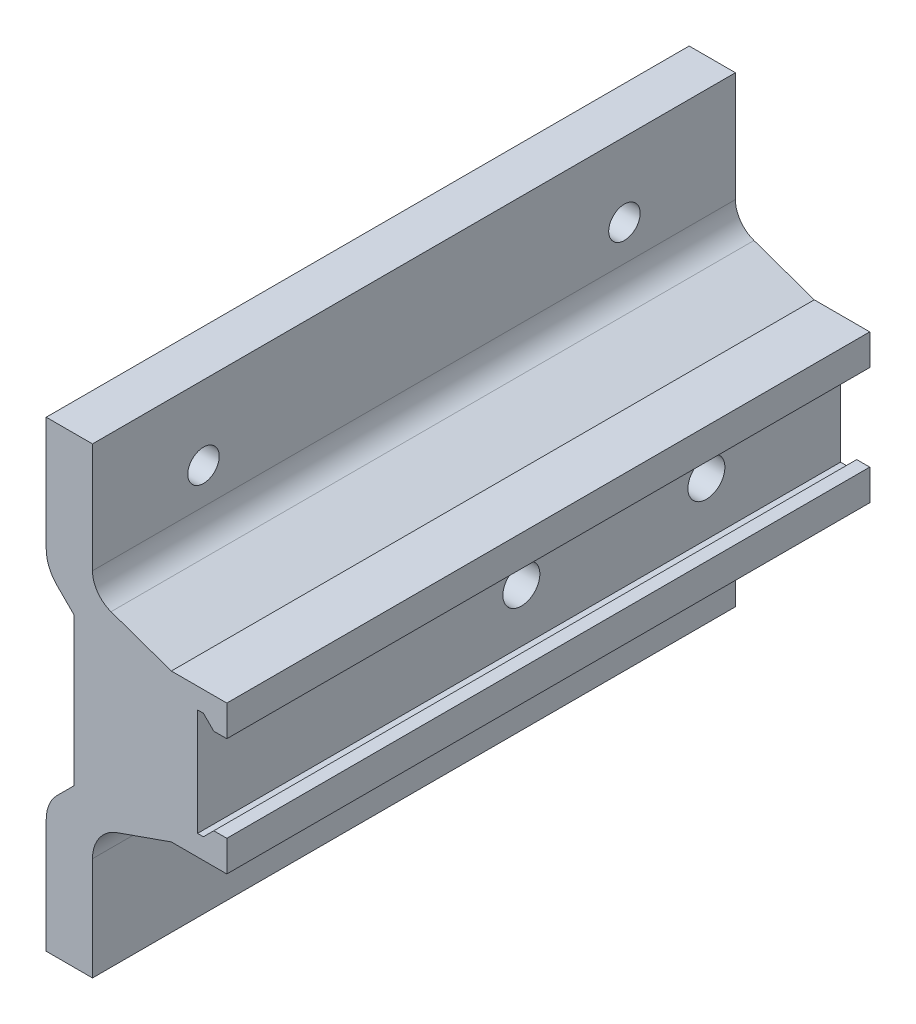
ISO-10303-21;
HEADER;
FILE_DESCRIPTION(('STEP AP214'),'2;1');
FILE_NAME('part.step','',(''),(''),'','','');
FILE_SCHEMA(('AUTOMOTIVE_DESIGN { 1 0 10303 214 1 1 1 1 }'));
ENDSEC;
DATA;
#1=APPLICATION_CONTEXT('core data for automotive mechanical design processes');
#2=APPLICATION_PROTOCOL_DEFINITION('international standard','automotive_design',2000,#1);
#3=PRODUCT_CONTEXT('',#1,'mechanical');
#4=PRODUCT('Part','Part','',(#3));
#5=PRODUCT_RELATED_PRODUCT_CATEGORY('part','',(#4));
#6=PRODUCT_DEFINITION_FORMATION('','',#4);
#7=PRODUCT_DEFINITION_CONTEXT('part definition',#1,'design');
#8=PRODUCT_DEFINITION('design','',#6,#7);
#9=PRODUCT_DEFINITION_SHAPE('','',#8);
#10=(LENGTH_UNIT() NAMED_UNIT(*) SI_UNIT(.MILLI.,.METRE.));
#11=(NAMED_UNIT(*) PLANE_ANGLE_UNIT() SI_UNIT($,.RADIAN.));
#12=(NAMED_UNIT(*) SI_UNIT($,.STERADIAN.) SOLID_ANGLE_UNIT());
#13=UNCERTAINTY_MEASURE_WITH_UNIT(LENGTH_MEASURE(1.E-05),#10,'distance_accuracy_value','');
#14=(GEOMETRIC_REPRESENTATION_CONTEXT(3) GLOBAL_UNCERTAINTY_ASSIGNED_CONTEXT((#13)) GLOBAL_UNIT_ASSIGNED_CONTEXT((#10,
#11,#12)) REPRESENTATION_CONTEXT('',''));
#15=CARTESIAN_POINT('',(0.,0.,0.));
#16=DIRECTION('',(0.,0.,1.));
#17=DIRECTION('',(1.,0.,0.));
#18=AXIS2_PLACEMENT_3D('',#15,#16,#17);
#19=CARTESIAN_POINT('',(-4.30260211183039,-5.62653158943432,69.5));
#20=DIRECTION('',(0.,1.,0.));
#21=DIRECTION('',(-1.,0.,0.));
#22=AXIS2_PLACEMENT_3D('',#19,#20,#21);
#23=PLANE('',#22);
#24=DIRECTION('',(1.,0.,0.));
#25=VECTOR('',#24,1.);
#26=CARTESIAN_POINT('',(-4.30260211183039,-5.62653158943432,0.));
#27=LINE('',#26,#25);
#28=CARTESIAN_POINT('',(-10.3026021118304,-5.62653158943431,0.));
#29=VERTEX_POINT('',#28);
#30=CARTESIAN_POINT('',(-4.30260211183039,-5.62653158943432,0.));
#31=VERTEX_POINT('',#30);
#32=EDGE_CURVE('E153',#29,#31,#27,.T.);
#33=ORIENTED_EDGE('',*,*,#32,.T.);
#34=DIRECTION('',(0.,0.,-1.));
#35=VECTOR('',#34,1.);
#36=CARTESIAN_POINT('',(-4.30260211183039,-5.62653158943432,69.5));
#37=LINE('',#36,#35);
#38=CARTESIAN_POINT('',(-4.30260211183039,-5.62653158943432,69.5));
#39=VERTEX_POINT('',#38);
#40=EDGE_CURVE('E42',#39,#31,#37,.T.);
#41=ORIENTED_EDGE('',*,*,#40,.F.);
#42=DIRECTION('',(1.,0.,0.));
#43=VECTOR('',#42,1.);
#44=CARTESIAN_POINT('',(-4.30260211183039,-5.62653158943432,69.5));
#45=LINE('',#44,#43);
#46=CARTESIAN_POINT('',(-10.3026021118304,-5.62653158943431,69.5));
#47=VERTEX_POINT('',#46);
#48=EDGE_CURVE('E105',#47,#39,#45,.T.);
#49=ORIENTED_EDGE('',*,*,#48,.F.);
#50=DIRECTION('',(0.,0.,-1.));
#51=VECTOR('',#50,1.);
#52=CARTESIAN_POINT('',(-10.3026021118304,-5.62653158943431,69.5));
#53=LINE('',#52,#51);
#54=EDGE_CURVE('E11',#47,#29,#53,.T.);
#55=ORIENTED_EDGE('',*,*,#54,.T.);
#56=EDGE_LOOP('',(#33,#41,#49,#55));
#57=FACE_BOUND('',#56,.T.);
#58=ADVANCED_FACE('F33',(#57),#23,.F.);
#59=CARTESIAN_POINT('',(-4.30260211183039,-2.28653158943431,69.5));
#60=DIRECTION('',(-1.,0.,0.));
#61=DIRECTION('',(0.,0.,1.));
#62=AXIS2_PLACEMENT_3D('',#59,#60,#61);
#63=PLANE('',#62);
#64=DIRECTION('',(0.,1.,0.));
#65=VECTOR('',#64,1.);
#66=CARTESIAN_POINT('',(-4.30260211183039,-2.28653158943431,0.));
#67=LINE('',#66,#65);
#68=CARTESIAN_POINT('',(-4.30260211183039,-2.28653158943431,0.));
#69=VERTEX_POINT('',#68);
#70=EDGE_CURVE('E155',#31,#69,#67,.T.);
#71=ORIENTED_EDGE('',*,*,#70,.T.);
#72=DIRECTION('',(0.,0.,-1.));
#73=VECTOR('',#72,1.);
#74=CARTESIAN_POINT('',(-4.30260211183039,-2.28653158943431,69.5));
#75=LINE('',#74,#73);
#76=CARTESIAN_POINT('',(-4.30260211183039,-2.28653158943431,69.5));
#77=VERTEX_POINT('',#76);
#78=EDGE_CURVE('E194',#77,#69,#75,.T.);
#79=ORIENTED_EDGE('',*,*,#78,.F.);
#80=DIRECTION('',(0.,1.,0.));
#81=VECTOR('',#80,1.);
#82=CARTESIAN_POINT('',(-4.30260211183039,-2.28653158943431,69.5));
#83=LINE('',#82,#81);
#84=EDGE_CURVE('E365',#39,#77,#83,.T.);
#85=ORIENTED_EDGE('',*,*,#84,.F.);
#86=ORIENTED_EDGE('',*,*,#40,.T.);
#87=EDGE_LOOP('',(#71,#79,#85,#86));
#88=FACE_BOUND('',#87,.T.);
#89=ADVANCED_FACE('F488',(#88),#63,.F.);
#90=CARTESIAN_POINT('',(-5.71260211183039,-2.28653158943431,69.5));
#91=DIRECTION('',(0.,-1.,0.));
#92=DIRECTION('',(0.,0.,-1.));
#93=AXIS2_PLACEMENT_3D('',#90,#91,#92);
#94=PLANE('',#93);
#95=DIRECTION('',(-1.,0.,0.));
#96=VECTOR('',#95,1.);
#97=CARTESIAN_POINT('',(-5.71260211183039,-2.28653158943431,0.));
#98=LINE('',#97,#96);
#99=CARTESIAN_POINT('',(-5.71260211183039,-2.28653158943431,0.));
#100=VERTEX_POINT('',#99);
#101=EDGE_CURVE('E158',#69,#100,#98,.T.);
#102=ORIENTED_EDGE('',*,*,#101,.T.);
#103=DIRECTION('',(0.,0.,-1.));
#104=VECTOR('',#103,1.);
#105=CARTESIAN_POINT('',(-5.71260211183039,-2.28653158943431,69.5));
#106=LINE('',#105,#104);
#107=CARTESIAN_POINT('',(-5.71260211183039,-2.28653158943431,69.5));
#108=VERTEX_POINT('',#107);
#109=EDGE_CURVE('E191',#108,#100,#106,.T.);
#110=ORIENTED_EDGE('',*,*,#109,.F.);
#111=DIRECTION('',(-1.,0.,0.));
#112=VECTOR('',#111,1.);
#113=CARTESIAN_POINT('',(-5.71260211183039,-2.28653158943431,69.5));
#114=LINE('',#113,#112);
#115=EDGE_CURVE('E367',#77,#108,#114,.T.);
#116=ORIENTED_EDGE('',*,*,#115,.F.);
#117=ORIENTED_EDGE('',*,*,#78,.T.);
#118=EDGE_LOOP('',(#102,#110,#116,#117));
#119=FACE_BOUND('',#118,.T.);
#120=ADVANCED_FACE('F492',(#119),#94,.F.);
#121=CARTESIAN_POINT('',(-6.8326021118304,-3.40653158943431,69.5));
#122=DIRECTION('',(0.707106781186547,-0.707106781186548,0.));
#123=DIRECTION('',(0.707106781186548,0.707106781186547,0.));
#124=AXIS2_PLACEMENT_3D('',#121,#122,#123);
#125=PLANE('',#124);
#126=DIRECTION('',(-0.707106781186548,-0.707106781186547,0.));
#127=VECTOR('',#126,1.);
#128=CARTESIAN_POINT('',(-6.8326021118304,-3.40653158943431,0.));
#129=LINE('',#128,#127);
#130=CARTESIAN_POINT('',(-6.8326021118304,-3.40653158943431,0.));
#131=VERTEX_POINT('',#130);
#132=EDGE_CURVE('E160',#100,#131,#129,.T.);
#133=ORIENTED_EDGE('',*,*,#132,.T.);
#134=DIRECTION('',(0.,0.,-1.));
#135=VECTOR('',#134,1.);
#136=CARTESIAN_POINT('',(-6.8326021118304,-3.40653158943431,69.5));
#137=LINE('',#136,#135);
#138=CARTESIAN_POINT('',(-6.8326021118304,-3.40653158943431,69.5));
#139=VERTEX_POINT('',#138);
#140=EDGE_CURVE('E188',#139,#131,#137,.T.);
#141=ORIENTED_EDGE('',*,*,#140,.F.);
#142=DIRECTION('',(-0.707106781186548,-0.707106781186547,0.));
#143=VECTOR('',#142,1.);
#144=CARTESIAN_POINT('',(-6.8326021118304,-3.40653158943431,69.5));
#145=LINE('',#144,#143);
#146=EDGE_CURVE('E369',#108,#139,#145,.T.);
#147=ORIENTED_EDGE('',*,*,#146,.F.);
#148=ORIENTED_EDGE('',*,*,#109,.T.);
#149=EDGE_LOOP('',(#133,#141,#147,#148));
#150=FACE_BOUND('',#149,.T.);
#151=ADVANCED_FACE('F505',(#150),#125,.F.);
#152=CARTESIAN_POINT('',(-6.8326021118304,-3.40653158943431,69.5));
#153=DIRECTION('',(0.,-1.,0.));
#154=DIRECTION('',(0.,0.,-1.));
#155=AXIS2_PLACEMENT_3D('',#152,#153,#154);
#156=PLANE('',#155);
#157=DIRECTION('',(-1.,0.,0.));
#158=VECTOR('',#157,1.);
#159=CARTESIAN_POINT('',(-6.8326021118304,-3.40653158943431,0.));
#160=LINE('',#159,#158);
#161=CARTESIAN_POINT('',(-7.4626021118304,-3.40653158943431,0.));
#162=VERTEX_POINT('',#161);
#163=EDGE_CURVE('E162',#131,#162,#160,.T.);
#164=ORIENTED_EDGE('',*,*,#163,.T.);
#165=DIRECTION('',(0.,0.,-1.));
#166=VECTOR('',#165,1.);
#167=CARTESIAN_POINT('',(-7.4626021118304,-3.40653158943431,69.5));
#168=LINE('',#167,#166);
#169=CARTESIAN_POINT('',(-7.4626021118304,-3.40653158943431,69.5));
#170=VERTEX_POINT('',#169);
#171=EDGE_CURVE('E185',#170,#162,#168,.T.);
#172=ORIENTED_EDGE('',*,*,#171,.F.);
#173=DIRECTION('',(-1.,0.,0.));
#174=VECTOR('',#173,1.);
#175=CARTESIAN_POINT('',(-6.8326021118304,-3.40653158943431,69.5));
#176=LINE('',#175,#174);
#177=EDGE_CURVE('E371',#139,#170,#176,.T.);
#178=ORIENTED_EDGE('',*,*,#177,.F.);
#179=ORIENTED_EDGE('',*,*,#140,.T.);
#180=EDGE_LOOP('',(#164,#172,#178,#179));
#181=FACE_BOUND('',#180,.T.);
#182=ADVANCED_FACE('F583',(#181),#156,.F.);
#183=CARTESIAN_POINT('',(-7.4626021118304,8.15346841056569,69.5));
#184=DIRECTION('',(-1.,0.,0.));
#185=DIRECTION('',(0.,0.,1.));
#186=AXIS2_PLACEMENT_3D('',#183,#184,#185);
#187=PLANE('',#186);
#188=CARTESIAN_POINT('',(-7.4626021118304,2.37346841056569,34.5));
#189=DIRECTION('',(-1.,0.,0.));
#190=DIRECTION('',(0.,0.,1.));
#191=AXIS2_PLACEMENT_3D('',#188,#189,#190);
#192=CIRCLE('',#191,2.);
#193=CARTESIAN_POINT('',(-7.4626021118304,2.37346841056569,36.5));
#194=VERTEX_POINT('',#193);
#195=EDGE_CURVE('E207',#194,#194,#192,.T.);
#196=ORIENTED_EDGE('',*,*,#195,.T.);
#197=EDGE_LOOP('',(#196));
#198=FACE_BOUND('',#197,.T.);
#199=CARTESIAN_POINT('',(-7.4626021118304,2.37346841056569,14.5));
#200=DIRECTION('',(-1.,0.,0.));
#201=DIRECTION('',(0.,0.,1.));
#202=AXIS2_PLACEMENT_3D('',#199,#200,#201);
#203=CIRCLE('',#202,2.);
#204=CARTESIAN_POINT('',(-7.4626021118304,2.37346841056569,16.5));
#205=VERTEX_POINT('',#204);
#206=EDGE_CURVE('E202',#205,#205,#203,.T.);
#207=ORIENTED_EDGE('',*,*,#206,.T.);
#208=EDGE_LOOP('',(#207));
#209=FACE_BOUND('',#208,.T.);
#210=DIRECTION('',(0.,1.,0.));
#211=VECTOR('',#210,1.);
#212=CARTESIAN_POINT('',(-7.4626021118304,8.15346841056569,0.));
#213=LINE('',#212,#211);
#214=CARTESIAN_POINT('',(-7.4626021118304,8.15346841056569,0.));
#215=VERTEX_POINT('',#214);
#216=EDGE_CURVE('E164',#162,#215,#213,.T.);
#217=ORIENTED_EDGE('',*,*,#216,.T.);
#218=DIRECTION('',(0.,0.,-1.));
#219=VECTOR('',#218,1.);
#220=CARTESIAN_POINT('',(-7.4626021118304,8.15346841056569,69.5));
#221=LINE('',#220,#219);
#222=CARTESIAN_POINT('',(-7.4626021118304,8.15346841056569,69.5));
#223=VERTEX_POINT('',#222);
#224=EDGE_CURVE('E182',#223,#215,#221,.T.);
#225=ORIENTED_EDGE('',*,*,#224,.F.);
#226=DIRECTION('',(0.,1.,0.));
#227=VECTOR('',#226,1.);
#228=CARTESIAN_POINT('',(-7.4626021118304,8.15346841056569,69.5));
#229=LINE('',#228,#227);
#230=EDGE_CURVE('E373',#170,#223,#229,.T.);
#231=ORIENTED_EDGE('',*,*,#230,.F.);
#232=ORIENTED_EDGE('',*,*,#171,.T.);
#233=EDGE_LOOP('',(#217,#225,#231,#232));
#234=FACE_BOUND('',#233,.T.);
#235=ADVANCED_FACE('F580',(#198,#209,#234),#187,.F.);
#236=CARTESIAN_POINT('',(-6.8326021118304,8.15346841056569,69.5));
#237=DIRECTION('',(0.,1.,0.));
#238=DIRECTION('',(0.,0.,1.));
#239=AXIS2_PLACEMENT_3D('',#236,#237,#238);
#240=PLANE('',#239);
#241=DIRECTION('',(1.,0.,0.));
#242=VECTOR('',#241,1.);
#243=CARTESIAN_POINT('',(-6.8326021118304,8.15346841056569,0.));
#244=LINE('',#243,#242);
#245=CARTESIAN_POINT('',(-6.8326021118304,8.15346841056569,0.));
#246=VERTEX_POINT('',#245);
#247=EDGE_CURVE('E166',#215,#246,#244,.T.);
#248=ORIENTED_EDGE('',*,*,#247,.T.);
#249=DIRECTION('',(0.,0.,-1.));
#250=VECTOR('',#249,1.);
#251=CARTESIAN_POINT('',(-6.8326021118304,8.15346841056569,69.5));
#252=LINE('',#251,#250);
#253=CARTESIAN_POINT('',(-6.8326021118304,8.15346841056569,69.5));
#254=VERTEX_POINT('',#253);
#255=EDGE_CURVE('E179',#254,#246,#252,.T.);
#256=ORIENTED_EDGE('',*,*,#255,.F.);
#257=DIRECTION('',(1.,0.,0.));
#258=VECTOR('',#257,1.);
#259=CARTESIAN_POINT('',(-6.8326021118304,8.15346841056569,69.5));
#260=LINE('',#259,#258);
#261=EDGE_CURVE('E375',#223,#254,#260,.T.);
#262=ORIENTED_EDGE('',*,*,#261,.F.);
#263=ORIENTED_EDGE('',*,*,#224,.T.);
#264=EDGE_LOOP('',(#248,#256,#262,#263));
#265=FACE_BOUND('',#264,.T.);
#266=ADVANCED_FACE('F381',(#265),#240,.F.);
#267=CARTESIAN_POINT('',(-6.8326021118304,8.15346841056569,69.5));
#268=DIRECTION('',(0.707106781186549,0.707106781186546,0.));
#269=DIRECTION('',(-0.707106781186546,0.707106781186549,0.));
#270=AXIS2_PLACEMENT_3D('',#267,#268,#269);
#271=PLANE('',#270);
#272=DIRECTION('',(0.707106781186546,-0.707106781186549,0.));
#273=VECTOR('',#272,1.);
#274=CARTESIAN_POINT('',(-6.8326021118304,8.15346841056569,0.));
#275=LINE('',#274,#273);
#276=CARTESIAN_POINT('',(-5.7126021118304,7.03346841056569,0.));
#277=VERTEX_POINT('',#276);
#278=EDGE_CURVE('E168',#246,#277,#275,.T.);
#279=ORIENTED_EDGE('',*,*,#278,.T.);
#280=DIRECTION('',(0.,0.,-1.));
#281=VECTOR('',#280,1.);
#282=CARTESIAN_POINT('',(-5.7126021118304,7.03346841056569,69.5));
#283=LINE('',#282,#281);
#284=CARTESIAN_POINT('',(-5.7126021118304,7.03346841056569,69.5));
#285=VERTEX_POINT('',#284);
#286=EDGE_CURVE('E144',#285,#277,#283,.T.);
#287=ORIENTED_EDGE('',*,*,#286,.F.);
#288=DIRECTION('',(0.707106781186546,-0.707106781186549,0.));
#289=VECTOR('',#288,1.);
#290=CARTESIAN_POINT('',(-6.8326021118304,8.15346841056569,69.5));
#291=LINE('',#290,#289);
#292=EDGE_CURVE('E139',#254,#285,#291,.T.);
#293=ORIENTED_EDGE('',*,*,#292,.F.);
#294=ORIENTED_EDGE('',*,*,#255,.T.);
#295=EDGE_LOOP('',(#279,#287,#293,#294));
#296=FACE_BOUND('',#295,.T.);
#297=ADVANCED_FACE('F385',(#296),#271,.F.);
#298=CARTESIAN_POINT('',(-5.7126021118304,7.03346841056569,69.5));
#299=DIRECTION('',(0.,1.,0.));
#300=DIRECTION('',(0.,0.,1.));
#301=AXIS2_PLACEMENT_3D('',#298,#299,#300);
#302=PLANE('',#301);
#303=DIRECTION('',(1.,0.,0.));
#304=VECTOR('',#303,1.);
#305=CARTESIAN_POINT('',(-5.7126021118304,7.03346841056569,0.));
#306=LINE('',#305,#304);
#307=CARTESIAN_POINT('',(-4.30260211183039,7.03346841056569,0.));
#308=VERTEX_POINT('',#307);
#309=EDGE_CURVE('E90',#277,#308,#306,.T.);
#310=ORIENTED_EDGE('',*,*,#309,.T.);
#311=DIRECTION('',(0.,0.,-1.));
#312=VECTOR('',#311,1.);
#313=CARTESIAN_POINT('',(-4.30260211183039,7.03346841056569,69.5));
#314=LINE('',#313,#312);
#315=CARTESIAN_POINT('',(-4.30260211183039,7.03346841056569,69.5));
#316=VERTEX_POINT('',#315);
#317=EDGE_CURVE('E142',#316,#308,#314,.T.);
#318=ORIENTED_EDGE('',*,*,#317,.F.);
#319=DIRECTION('',(1.,0.,0.));
#320=VECTOR('',#319,1.);
#321=CARTESIAN_POINT('',(-5.7126021118304,7.03346841056569,69.5));
#322=LINE('',#321,#320);
#323=EDGE_CURVE('E134',#285,#316,#322,.T.);
#324=ORIENTED_EDGE('',*,*,#323,.F.);
#325=ORIENTED_EDGE('',*,*,#286,.T.);
#326=EDGE_LOOP('',(#310,#318,#324,#325));
#327=FACE_BOUND('',#326,.T.);
#328=ADVANCED_FACE('F143',(#327),#302,.F.);
#329=CARTESIAN_POINT('',(-4.30260211183039,7.03346841056569,69.5));
#330=DIRECTION('',(-1.,0.,0.));
#331=DIRECTION('',(0.,0.,1.));
#332=AXIS2_PLACEMENT_3D('',#329,#330,#331);
#333=PLANE('',#332);
#334=DIRECTION('',(0.,1.,0.));
#335=VECTOR('',#334,1.);
#336=CARTESIAN_POINT('',(-4.30260211183039,7.03346841056569,0.));
#337=LINE('',#336,#335);
#338=CARTESIAN_POINT('',(-4.30260211183039,10.3734684105657,0.));
#339=VERTEX_POINT('',#338);
#340=EDGE_CURVE('E97',#308,#339,#337,.T.);
#341=ORIENTED_EDGE('',*,*,#340,.T.);
#342=DIRECTION('',(0.,0.,-1.));
#343=VECTOR('',#342,1.);
#344=CARTESIAN_POINT('',(-4.30260211183039,10.3734684105657,69.5));
#345=LINE('',#344,#343);
#346=CARTESIAN_POINT('',(-4.30260211183039,10.3734684105657,69.5));
#347=VERTEX_POINT('',#346);
#348=EDGE_CURVE('E145',#347,#339,#345,.T.);
#349=ORIENTED_EDGE('',*,*,#348,.F.);
#350=DIRECTION('',(0.,1.,0.));
#351=VECTOR('',#350,1.);
#352=CARTESIAN_POINT('',(-4.30260211183039,7.03346841056569,69.5));
#353=LINE('',#352,#351);
#354=EDGE_CURVE('E137',#316,#347,#353,.T.);
#355=ORIENTED_EDGE('',*,*,#354,.F.);
#356=ORIENTED_EDGE('',*,*,#317,.T.);
#357=EDGE_LOOP('',(#341,#349,#355,#356));
#358=FACE_BOUND('',#357,.T.);
#359=ADVANCED_FACE('F147',(#358),#333,.F.);
#360=CARTESIAN_POINT('',(-4.30260211183039,10.3734684105657,69.5));
#361=DIRECTION('',(0.,-1.,0.));
#362=DIRECTION('',(1.,0.,0.));
#363=AXIS2_PLACEMENT_3D('',#360,#361,#362);
#364=PLANE('',#363);
#365=DIRECTION('',(-1.,0.,0.));
#366=VECTOR('',#365,1.);
#367=CARTESIAN_POINT('',(-4.30260211183039,10.3734684105657,0.));
#368=LINE('',#367,#366);
#369=CARTESIAN_POINT('',(-10.3026021118304,10.3734684105657,0.));
#370=VERTEX_POINT('',#369);
#371=EDGE_CURVE('E172',#339,#370,#368,.T.);
#372=ORIENTED_EDGE('',*,*,#371,.T.);
#373=DIRECTION('',(0.,0.,-1.));
#374=VECTOR('',#373,1.);
#375=CARTESIAN_POINT('',(-10.3026021118304,10.3734684105657,69.5));
#376=LINE('',#375,#374);
#377=CARTESIAN_POINT('',(-10.3026021118304,10.3734684105657,69.5));
#378=VERTEX_POINT('',#377);
#379=EDGE_CURVE('E149',#378,#370,#376,.T.);
#380=ORIENTED_EDGE('',*,*,#379,.F.);
#381=DIRECTION('',(-1.,0.,0.));
#382=VECTOR('',#381,1.);
#383=CARTESIAN_POINT('',(-4.30260211183039,10.3734684105657,69.5));
#384=LINE('',#383,#382);
#385=EDGE_CURVE('E51',#347,#378,#384,.T.);
#386=ORIENTED_EDGE('',*,*,#385,.F.);
#387=ORIENTED_EDGE('',*,*,#348,.T.);
#388=EDGE_LOOP('',(#372,#380,#386,#387));
#389=FACE_BOUND('',#388,.T.);
#390=ADVANCED_FACE('F393',(#389),#364,.F.);
#391=CARTESIAN_POINT('',(0.,0.,69.5));
#392=DIRECTION('',(0.,0.,-1.));
#393=DIRECTION('',(-1.,0.,0.));
#394=AXIS2_PLACEMENT_3D('',#391,#392,#393);
#395=PLANE('',#394);
#396=ORIENTED_EDGE('',*,*,#385,.T.);
#397=DIRECTION('',(-0.943249385695404,0.332085224581346,0.));
#398=VECTOR('',#397,1.);
#399=CARTESIAN_POINT('',(-16.8200082241513,12.6680198890194,69.5));
#400=LINE('',#399,#398);
#401=CARTESIAN_POINT('',(-16.8200082241513,12.6680198890194,69.5));
#402=VERTEX_POINT('',#401);
#403=EDGE_CURVE('E234',#378,#402,#400,.T.);
#404=ORIENTED_EDGE('',*,*,#403,.T.);
#405=CARTESIAN_POINT('',(-15.8237525504072,15.4977680461056,69.5));
#406=DIRECTION('',(0.,0.,-1.));
#407=DIRECTION('',(-1.,0.,0.));
#408=AXIS2_PLACEMENT_3D('',#405,#406,#407);
#409=CIRCLE('',#408,3.);
#410=CARTESIAN_POINT('',(-18.8237525504072,15.4977680461056,69.5));
#411=VERTEX_POINT('',#410);
#412=EDGE_CURVE('E275',#402,#411,#409,.T.);
#413=ORIENTED_EDGE('',*,*,#412,.T.);
#414=DIRECTION('',(0.,1.,0.));
#415=VECTOR('',#414,1.);
#416=CARTESIAN_POINT('',(-18.8237525504072,27.3734684105657,69.5));
#417=LINE('',#416,#415);
#418=CARTESIAN_POINT('',(-18.8237525504072,27.3734684105657,69.5));
#419=VERTEX_POINT('',#418);
#420=EDGE_CURVE('E272',#411,#419,#417,.T.);
#421=ORIENTED_EDGE('',*,*,#420,.T.);
#422=DIRECTION('',(-1.,0.,0.));
#423=VECTOR('',#422,1.);
#424=CARTESIAN_POINT('',(-18.8237525504072,27.3734684105657,69.5));
#425=LINE('',#424,#423);
#426=CARTESIAN_POINT('',(-23.8237525504072,27.3734684105657,69.5));
#427=VERTEX_POINT('',#426);
#428=EDGE_CURVE('E269',#419,#427,#425,.T.);
#429=ORIENTED_EDGE('',*,*,#428,.T.);
#430=DIRECTION('',(0.,-1.,0.));
#431=VECTOR('',#430,1.);
#432=CARTESIAN_POINT('',(-23.8237525504072,27.3734684105657,69.5));
#433=LINE('',#432,#431);
#434=CARTESIAN_POINT('',(-23.8237525504072,15.0303226600581,69.5));
#435=VERTEX_POINT('',#434);
#436=EDGE_CURVE('E266',#427,#435,#433,.T.);
#437=ORIENTED_EDGE('',*,*,#436,.T.);
#438=CARTESIAN_POINT('',(-19.8237525504072,15.0303226600581,69.5));
#439=DIRECTION('',(0.,0.,1.));
#440=DIRECTION('',(-1.,0.,0.));
#441=AXIS2_PLACEMENT_3D('',#438,#439,#440);
#442=CIRCLE('',#441,4.);
#443=CARTESIAN_POINT('',(-22.6521796751534,12.2018955353119,69.5));
#444=VERTEX_POINT('',#443);
#445=EDGE_CURVE('E263',#435,#444,#442,.T.);
#446=ORIENTED_EDGE('',*,*,#445,.T.);
#447=DIRECTION('',(0.707106781186546,-0.707106781186549,0.));
#448=VECTOR('',#447,1.);
#449=CARTESIAN_POINT('',(-22.6521796751534,12.2018955353119,69.5));
#450=LINE('',#449,#448);
#451=CARTESIAN_POINT('',(-20.8237525504072,10.3734684105657,69.5));
#452=VERTEX_POINT('',#451);
#453=EDGE_CURVE('E260',#444,#452,#450,.T.);
#454=ORIENTED_EDGE('',*,*,#453,.T.);
#455=DIRECTION('',(0.,-1.,0.));
#456=VECTOR('',#455,1.);
#457=CARTESIAN_POINT('',(-20.8237525504072,10.3734684105657,69.5));
#458=LINE('',#457,#456);
#459=CARTESIAN_POINT('',(-20.8237525504072,-5.62653158943431,69.5));
#460=VERTEX_POINT('',#459);
#461=EDGE_CURVE('E257',#452,#460,#458,.T.);
#462=ORIENTED_EDGE('',*,*,#461,.T.);
#463=DIRECTION('',(-0.707106781186546,-0.707106781186549,0.));
#464=VECTOR('',#463,1.);
#465=CARTESIAN_POINT('',(-20.8237525504072,-5.62653158943431,69.5));
#466=LINE('',#465,#464);
#467=CARTESIAN_POINT('',(-22.6521796751534,-7.4549587141805,69.5));
#468=VERTEX_POINT('',#467);
#469=EDGE_CURVE('E254',#460,#468,#466,.T.);
#470=ORIENTED_EDGE('',*,*,#469,.T.);
#471=CARTESIAN_POINT('',(-19.8237525504072,-10.2833858389267,69.5));
#472=DIRECTION('',(0.,0.,1.));
#473=DIRECTION('',(-1.,0.,0.));
#474=AXIS2_PLACEMENT_3D('',#471,#472,#473);
#475=CIRCLE('',#474,4.);
#476=CARTESIAN_POINT('',(-23.8237525504072,-10.2833858389267,69.5));
#477=VERTEX_POINT('',#476);
#478=EDGE_CURVE('E251',#468,#477,#475,.T.);
#479=ORIENTED_EDGE('',*,*,#478,.T.);
#480=DIRECTION('',(0.,-1.,0.));
#481=VECTOR('',#480,1.);
#482=CARTESIAN_POINT('',(-23.8237525504072,-10.2833858389267,69.5));
#483=LINE('',#482,#481);
#484=CARTESIAN_POINT('',(-23.8237525504072,-22.6265315894343,69.5));
#485=VERTEX_POINT('',#484);
#486=EDGE_CURVE('E248',#477,#485,#483,.T.);
#487=ORIENTED_EDGE('',*,*,#486,.T.);
#488=DIRECTION('',(1.,0.,0.));
#489=VECTOR('',#488,1.);
#490=CARTESIAN_POINT('',(-18.8237525504072,-22.6265315894343,69.5));
#491=LINE('',#490,#489);
#492=CARTESIAN_POINT('',(-18.8237525504072,-22.6265315894343,69.5));
#493=VERTEX_POINT('',#492);
#494=EDGE_CURVE('E245',#485,#493,#491,.T.);
#495=ORIENTED_EDGE('',*,*,#494,.T.);
#496=DIRECTION('',(0.,1.,0.));
#497=VECTOR('',#496,1.);
#498=CARTESIAN_POINT('',(-18.8237525504072,-22.6265315894343,69.5));
#499=LINE('',#498,#497);
#500=CARTESIAN_POINT('',(-18.8237525504072,-11.4589311034875,69.5));
#501=VERTEX_POINT('',#500);
#502=EDGE_CURVE('E242',#493,#501,#499,.T.);
#503=ORIENTED_EDGE('',*,*,#502,.T.);
#504=CARTESIAN_POINT('',(-14.8237525504072,-11.4589311034875,69.5));
#505=DIRECTION('',(0.,0.,-1.));
#506=DIRECTION('',(-1.,0.,0.));
#507=AXIS2_PLACEMENT_3D('',#504,#505,#506);
#508=CIRCLE('',#507,4.);
#509=CARTESIAN_POINT('',(-16.1520934487326,-7.68593356070588,69.5));
#510=VERTEX_POINT('',#509);
#511=EDGE_CURVE('E239',#501,#510,#508,.T.);
#512=ORIENTED_EDGE('',*,*,#511,.T.);
#513=DIRECTION('',(0.943249385695404,0.332085224581346,0.));
#514=VECTOR('',#513,1.);
#515=CARTESIAN_POINT('',(-16.1520934487326,-7.68593356070588,69.5));
#516=LINE('',#515,#514);
#517=EDGE_CURVE('E235',#510,#47,#516,.T.);
#518=ORIENTED_EDGE('',*,*,#517,.T.);
#519=ORIENTED_EDGE('',*,*,#48,.T.);
#520=ORIENTED_EDGE('',*,*,#84,.T.);
#521=ORIENTED_EDGE('',*,*,#115,.T.);
#522=ORIENTED_EDGE('',*,*,#146,.T.);
#523=ORIENTED_EDGE('',*,*,#177,.T.);
#524=ORIENTED_EDGE('',*,*,#230,.T.);
#525=ORIENTED_EDGE('',*,*,#261,.T.);
#526=ORIENTED_EDGE('',*,*,#292,.T.);
#527=ORIENTED_EDGE('',*,*,#323,.T.);
#528=ORIENTED_EDGE('',*,*,#354,.T.);
#529=EDGE_LOOP('',(#396,#404,#413,#421,#429,#437,#446,#454,#462,#470,#479,#487,#495,#503,#512,
#518,#519,#520,#521,#522,#523,#524,#525,#526,#527,#528));
#530=FACE_BOUND('',#529,.T.);
#531=ADVANCED_FACE('F135',(#530),#395,.F.);
#532=CARTESIAN_POINT('',(0.,0.,0.));
#533=DIRECTION('',(0.,0.,-1.));
#534=DIRECTION('',(-1.,0.,0.));
#535=AXIS2_PLACEMENT_3D('',#532,#533,#534);
#536=PLANE('',#535);
#537=ORIENTED_EDGE('',*,*,#32,.F.);
#538=DIRECTION('',(0.943249385695404,0.332085224581346,0.));
#539=VECTOR('',#538,1.);
#540=CARTESIAN_POINT('',(-16.1520934487326,-7.68593356070588,0.));
#541=LINE('',#540,#539);
#542=CARTESIAN_POINT('',(-16.1520934487326,-7.68593356070587,0.));
#543=VERTEX_POINT('',#542);
#544=EDGE_CURVE('E285',#543,#29,#541,.T.);
#545=ORIENTED_EDGE('',*,*,#544,.F.);
#546=CARTESIAN_POINT('',(-14.8237525504072,-11.4589311034875,0.));
#547=DIRECTION('',(0.,0.,-1.));
#548=DIRECTION('',(-1.,0.,0.));
#549=AXIS2_PLACEMENT_3D('',#546,#547,#548);
#550=CIRCLE('',#549,4.);
#551=CARTESIAN_POINT('',(-18.8237525504072,-11.4589311034875,0.));
#552=VERTEX_POINT('',#551);
#553=EDGE_CURVE('E289',#552,#543,#550,.T.);
#554=ORIENTED_EDGE('',*,*,#553,.F.);
#555=DIRECTION('',(0.,1.,0.));
#556=VECTOR('',#555,1.);
#557=CARTESIAN_POINT('',(-18.8237525504072,-22.6265315894343,0.));
#558=LINE('',#557,#556);
#559=CARTESIAN_POINT('',(-18.8237525504072,-22.6265315894343,0.));
#560=VERTEX_POINT('',#559);
#561=EDGE_CURVE('E293',#560,#552,#558,.T.);
#562=ORIENTED_EDGE('',*,*,#561,.F.);
#563=DIRECTION('',(1.,0.,0.));
#564=VECTOR('',#563,1.);
#565=CARTESIAN_POINT('',(-18.8237525504072,-22.6265315894343,0.));
#566=LINE('',#565,#564);
#567=CARTESIAN_POINT('',(-23.8237525504072,-22.6265315894343,0.));
#568=VERTEX_POINT('',#567);
#569=EDGE_CURVE('E297',#568,#560,#566,.T.);
#570=ORIENTED_EDGE('',*,*,#569,.F.);
#571=DIRECTION('',(0.,-1.,0.));
#572=VECTOR('',#571,1.);
#573=CARTESIAN_POINT('',(-23.8237525504072,-10.2833858389267,0.));
#574=LINE('',#573,#572);
#575=CARTESIAN_POINT('',(-23.8237525504072,-10.2833858389267,0.));
#576=VERTEX_POINT('',#575);
#577=EDGE_CURVE('E301',#576,#568,#574,.T.);
#578=ORIENTED_EDGE('',*,*,#577,.F.);
#579=CARTESIAN_POINT('',(-19.8237525504072,-10.2833858389267,0.));
#580=DIRECTION('',(0.,0.,-1.));
#581=DIRECTION('',(-1.,0.,0.));
#582=AXIS2_PLACEMENT_3D('',#579,#580,#581);
#583=CIRCLE('',#582,4.);
#584=CARTESIAN_POINT('',(-22.6521796751534,-7.4549587141805,0.));
#585=VERTEX_POINT('',#584);
#586=EDGE_CURVE('E305',#585,#576,#583,.F.);
#587=ORIENTED_EDGE('',*,*,#586,.F.);
#588=DIRECTION('',(-0.707106781186546,-0.707106781186549,0.));
#589=VECTOR('',#588,1.);
#590=CARTESIAN_POINT('',(-20.8237525504072,-5.62653158943431,0.));
#591=LINE('',#590,#589);
#592=CARTESIAN_POINT('',(-20.8237525504072,-5.62653158943431,0.));
#593=VERTEX_POINT('',#592);
#594=EDGE_CURVE('E309',#593,#585,#591,.T.);
#595=ORIENTED_EDGE('',*,*,#594,.F.);
#596=DIRECTION('',(0.,-1.,0.));
#597=VECTOR('',#596,1.);
#598=CARTESIAN_POINT('',(-20.8237525504072,10.3734684105657,0.));
#599=LINE('',#598,#597);
#600=CARTESIAN_POINT('',(-20.8237525504072,10.3734684105657,0.));
#601=VERTEX_POINT('',#600);
#602=EDGE_CURVE('E313',#601,#593,#599,.T.);
#603=ORIENTED_EDGE('',*,*,#602,.F.);
#604=DIRECTION('',(0.707106781186546,-0.707106781186549,0.));
#605=VECTOR('',#604,1.);
#606=CARTESIAN_POINT('',(-22.6521796751534,12.2018955353119,0.));
#607=LINE('',#606,#605);
#608=CARTESIAN_POINT('',(-22.6521796751534,12.2018955353119,0.));
#609=VERTEX_POINT('',#608);
#610=EDGE_CURVE('E317',#609,#601,#607,.T.);
#611=ORIENTED_EDGE('',*,*,#610,.F.);
#612=CARTESIAN_POINT('',(-19.8237525504072,15.0303226600581,0.));
#613=DIRECTION('',(0.,0.,-1.));
#614=DIRECTION('',(-1.,0.,0.));
#615=AXIS2_PLACEMENT_3D('',#612,#613,#614);
#616=CIRCLE('',#615,4.);
#617=CARTESIAN_POINT('',(-23.8237525504072,15.0303226600581,0.));
#618=VERTEX_POINT('',#617);
#619=EDGE_CURVE('E321',#618,#609,#616,.F.);
#620=ORIENTED_EDGE('',*,*,#619,.F.);
#621=DIRECTION('',(0.,-1.,0.));
#622=VECTOR('',#621,1.);
#623=CARTESIAN_POINT('',(-23.8237525504072,27.3734684105657,0.));
#624=LINE('',#623,#622);
#625=CARTESIAN_POINT('',(-23.8237525504072,27.3734684105657,0.));
#626=VERTEX_POINT('',#625);
#627=EDGE_CURVE('E325',#626,#618,#624,.T.);
#628=ORIENTED_EDGE('',*,*,#627,.F.);
#629=DIRECTION('',(-1.,0.,0.));
#630=VECTOR('',#629,1.);
#631=CARTESIAN_POINT('',(-18.8237525504072,27.3734684105657,0.));
#632=LINE('',#631,#630);
#633=CARTESIAN_POINT('',(-18.8237525504072,27.3734684105657,0.));
#634=VERTEX_POINT('',#633);
#635=EDGE_CURVE('E329',#634,#626,#632,.T.);
#636=ORIENTED_EDGE('',*,*,#635,.F.);
#637=DIRECTION('',(0.,1.,0.));
#638=VECTOR('',#637,1.);
#639=CARTESIAN_POINT('',(-18.8237525504072,27.3734684105657,0.));
#640=LINE('',#639,#638);
#641=CARTESIAN_POINT('',(-18.8237525504072,15.4977680461056,0.));
#642=VERTEX_POINT('',#641);
#643=EDGE_CURVE('E333',#642,#634,#640,.T.);
#644=ORIENTED_EDGE('',*,*,#643,.F.);
#645=CARTESIAN_POINT('',(-15.8237525504072,15.4977680461056,0.));
#646=DIRECTION('',(0.,0.,-1.));
#647=DIRECTION('',(-1.,0.,0.));
#648=AXIS2_PLACEMENT_3D('',#645,#646,#647);
#649=CIRCLE('',#648,3.);
#650=CARTESIAN_POINT('',(-16.8200082241513,12.6680198890194,0.));
#651=VERTEX_POINT('',#650);
#652=EDGE_CURVE('E238',#651,#642,#649,.T.);
#653=ORIENTED_EDGE('',*,*,#652,.F.);
#654=DIRECTION('',(-0.943249385695404,0.332085224581346,0.));
#655=VECTOR('',#654,1.);
#656=CARTESIAN_POINT('',(-16.8200082241513,12.6680198890194,0.));
#657=LINE('',#656,#655);
#658=EDGE_CURVE('E282',#370,#651,#657,.T.);
#659=ORIENTED_EDGE('',*,*,#658,.F.);
#660=ORIENTED_EDGE('',*,*,#371,.F.);
#661=ORIENTED_EDGE('',*,*,#340,.F.);
#662=ORIENTED_EDGE('',*,*,#309,.F.);
#663=ORIENTED_EDGE('',*,*,#278,.F.);
#664=ORIENTED_EDGE('',*,*,#247,.F.);
#665=ORIENTED_EDGE('',*,*,#216,.F.);
#666=ORIENTED_EDGE('',*,*,#163,.F.);
#667=ORIENTED_EDGE('',*,*,#132,.F.);
#668=ORIENTED_EDGE('',*,*,#101,.F.);
#669=ORIENTED_EDGE('',*,*,#70,.F.);
#670=EDGE_LOOP('',(#537,#545,#554,#562,#570,#578,#587,#595,#603,#611,#620,#628,#636,#644,#653,
#659,#660,#661,#662,#663,#664,#665,#666,#667,#668,#669));
#671=FACE_BOUND('',#670,.T.);
#672=ADVANCED_FACE('F387',(#671),#536,.T.);
#673=CARTESIAN_POINT('',(-15.8237525504072,15.4977680461056,-51.7959603558292));
#674=DIRECTION('',(0.,0.,1.));
#675=DIRECTION('',(1.,0.,0.));
#676=AXIS2_PLACEMENT_3D('',#673,#674,#675);
#677=CYLINDRICAL_SURFACE('',#676,3.);
#678=DIRECTION('',(0.,0.,1.));
#679=VECTOR('',#678,1.);
#680=CARTESIAN_POINT('',(-16.8200082241513,12.6680198890194,-51.7959603558292));
#681=LINE('',#680,#679);
#682=EDGE_CURVE('E156',#651,#402,#681,.T.);
#683=ORIENTED_EDGE('',*,*,#682,.F.);
#684=ORIENTED_EDGE('',*,*,#652,.T.);
#685=DIRECTION('',(0.,0.,1.));
#686=VECTOR('',#685,1.);
#687=CARTESIAN_POINT('',(-18.8237525504072,15.4977680461056,-51.7959603558292));
#688=LINE('',#687,#686);
#689=EDGE_CURVE('E281',#642,#411,#688,.T.);
#690=ORIENTED_EDGE('',*,*,#689,.T.);
#691=ORIENTED_EDGE('',*,*,#412,.F.);
#692=EDGE_LOOP('',(#683,#684,#690,#691));
#693=FACE_BOUND('',#692,.T.);
#694=ADVANCED_FACE('F467',(#693),#677,.F.);
#695=CARTESIAN_POINT('',(-18.8237525504072,27.3734684105657,-51.7959603558292));
#696=DIRECTION('',(1.,0.,0.));
#697=DIRECTION('',(0.,1.,0.));
#698=AXIS2_PLACEMENT_3D('',#695,#696,#697);
#699=PLANE('',#698);
#700=CARTESIAN_POINT('',(-18.8237525504072,19.3734684105657,57.5));
#701=DIRECTION('',(1.,0.,0.));
#702=DIRECTION('',(0.,1.,0.));
#703=AXIS2_PLACEMENT_3D('',#700,#701,#702);
#704=CIRCLE('',#703,1.7);
#705=CARTESIAN_POINT('',(-18.8237525504072,21.0734684105657,57.5));
#706=VERTEX_POINT('',#705);
#707=EDGE_CURVE('E203',#706,#706,#704,.T.);
#708=ORIENTED_EDGE('',*,*,#707,.F.);
#709=EDGE_LOOP('',(#708));
#710=FACE_BOUND('',#709,.T.);
#711=CARTESIAN_POINT('',(-18.8237525504072,19.3734684105657,12.));
#712=DIRECTION('',(1.,0.,0.));
#713=DIRECTION('',(0.,1.,0.));
#714=AXIS2_PLACEMENT_3D('',#711,#712,#713);
#715=CIRCLE('',#714,1.7);
#716=CARTESIAN_POINT('',(-18.8237525504072,21.0734684105657,12.));
#717=VERTEX_POINT('',#716);
#718=EDGE_CURVE('E217',#717,#717,#715,.T.);
#719=ORIENTED_EDGE('',*,*,#718,.F.);
#720=EDGE_LOOP('',(#719));
#721=FACE_BOUND('',#720,.T.);
#722=ORIENTED_EDGE('',*,*,#689,.F.);
#723=ORIENTED_EDGE('',*,*,#643,.T.);
#724=DIRECTION('',(0.,0.,1.));
#725=VECTOR('',#724,1.);
#726=CARTESIAN_POINT('',(-18.8237525504072,27.3734684105657,-51.7959603558292));
#727=LINE('',#726,#725);
#728=EDGE_CURVE('E332',#634,#419,#727,.T.);
#729=ORIENTED_EDGE('',*,*,#728,.T.);
#730=ORIENTED_EDGE('',*,*,#420,.F.);
#731=EDGE_LOOP('',(#722,#723,#729,#730));
#732=FACE_BOUND('',#731,.T.);
#733=ADVANCED_FACE('F469',(#710,#721,#732),#699,.T.);
#734=CARTESIAN_POINT('',(-18.8237525504072,27.3734684105657,-51.7959603558292));
#735=DIRECTION('',(0.,1.,0.));
#736=DIRECTION('',(-1.,0.,0.));
#737=AXIS2_PLACEMENT_3D('',#734,#735,#736);
#738=PLANE('',#737);
#739=ORIENTED_EDGE('',*,*,#728,.F.);
#740=ORIENTED_EDGE('',*,*,#635,.T.);
#741=DIRECTION('',(0.,0.,1.));
#742=VECTOR('',#741,1.);
#743=CARTESIAN_POINT('',(-23.8237525504072,27.3734684105657,-51.7959603558292));
#744=LINE('',#743,#742);
#745=EDGE_CURVE('E328',#626,#427,#744,.T.);
#746=ORIENTED_EDGE('',*,*,#745,.T.);
#747=ORIENTED_EDGE('',*,*,#428,.F.);
#748=EDGE_LOOP('',(#739,#740,#746,#747));
#749=FACE_BOUND('',#748,.T.);
#750=ADVANCED_FACE('F551',(#749),#738,.T.);
#751=CARTESIAN_POINT('',(-23.8237525504072,27.3734684105657,-51.7959603558292));
#752=DIRECTION('',(-1.,0.,0.));
#753=DIRECTION('',(0.,-1.,0.));
#754=AXIS2_PLACEMENT_3D('',#751,#752,#753);
#755=PLANE('',#754);
#756=CARTESIAN_POINT('',(-23.8237525504072,19.3734684105657,57.5));
#757=DIRECTION('',(-1.,0.,0.));
#758=DIRECTION('',(0.,-1.,0.));
#759=AXIS2_PLACEMENT_3D('',#756,#757,#758);
#760=CIRCLE('',#759,1.7);
#761=CARTESIAN_POINT('',(-23.8237525504072,17.6734684105657,57.5));
#762=VERTEX_POINT('',#761);
#763=EDGE_CURVE('E36',#762,#762,#760,.T.);
#764=ORIENTED_EDGE('',*,*,#763,.F.);
#765=EDGE_LOOP('',(#764));
#766=FACE_BOUND('',#765,.T.);
#767=CARTESIAN_POINT('',(-23.8237525504072,19.3734684105657,12.));
#768=DIRECTION('',(-1.,0.,0.));
#769=DIRECTION('',(0.,-1.,0.));
#770=AXIS2_PLACEMENT_3D('',#767,#768,#769);
#771=CIRCLE('',#770,1.7);
#772=CARTESIAN_POINT('',(-23.8237525504072,17.6734684105657,12.));
#773=VERTEX_POINT('',#772);
#774=EDGE_CURVE('E215',#773,#773,#771,.T.);
#775=ORIENTED_EDGE('',*,*,#774,.F.);
#776=EDGE_LOOP('',(#775));
#777=FACE_BOUND('',#776,.T.);
#778=ORIENTED_EDGE('',*,*,#745,.F.);
#779=ORIENTED_EDGE('',*,*,#627,.T.);
#780=DIRECTION('',(0.,0.,1.));
#781=VECTOR('',#780,1.);
#782=CARTESIAN_POINT('',(-23.8237525504072,15.0303226600581,-51.7959603558292));
#783=LINE('',#782,#781);
#784=EDGE_CURVE('E324',#618,#435,#783,.T.);
#785=ORIENTED_EDGE('',*,*,#784,.T.);
#786=ORIENTED_EDGE('',*,*,#436,.F.);
#787=EDGE_LOOP('',(#778,#779,#785,#786));
#788=FACE_BOUND('',#787,.T.);
#789=ADVANCED_FACE('F549',(#766,#777,#788),#755,.T.);
#790=CARTESIAN_POINT('',(-19.8237525504072,15.0303226600581,-51.7959603558292));
#791=DIRECTION('',(0.,0.,1.));
#792=DIRECTION('',(1.,0.,0.));
#793=AXIS2_PLACEMENT_3D('',#790,#791,#792);
#794=CYLINDRICAL_SURFACE('',#793,4.);
#795=ORIENTED_EDGE('',*,*,#784,.F.);
#796=ORIENTED_EDGE('',*,*,#619,.T.);
#797=DIRECTION('',(0.,0.,1.));
#798=VECTOR('',#797,1.);
#799=CARTESIAN_POINT('',(-22.6521796751534,12.2018955353119,-51.7959603558292));
#800=LINE('',#799,#798);
#801=EDGE_CURVE('E320',#609,#444,#800,.T.);
#802=ORIENTED_EDGE('',*,*,#801,.T.);
#803=ORIENTED_EDGE('',*,*,#445,.F.);
#804=EDGE_LOOP('',(#795,#796,#802,#803));
#805=FACE_BOUND('',#804,.T.);
#806=ADVANCED_FACE('F545',(#805),#794,.T.);
#807=CARTESIAN_POINT('',(-22.6521796751534,12.2018955353119,-51.7959603558292));
#808=DIRECTION('',(-0.707106781186549,-0.707106781186546,0.));
#809=DIRECTION('',(0.707106781186546,-0.707106781186549,0.));
#810=AXIS2_PLACEMENT_3D('',#807,#808,#809);
#811=PLANE('',#810);
#812=ORIENTED_EDGE('',*,*,#801,.F.);
#813=ORIENTED_EDGE('',*,*,#610,.T.);
#814=DIRECTION('',(0.,0.,1.));
#815=VECTOR('',#814,1.);
#816=CARTESIAN_POINT('',(-20.8237525504072,10.3734684105657,-51.7959603558292));
#817=LINE('',#816,#815);
#818=EDGE_CURVE('E316',#601,#452,#817,.T.);
#819=ORIENTED_EDGE('',*,*,#818,.T.);
#820=ORIENTED_EDGE('',*,*,#453,.F.);
#821=EDGE_LOOP('',(#812,#813,#819,#820));
#822=FACE_BOUND('',#821,.T.);
#823=ADVANCED_FACE('F541',(#822),#811,.T.);
#824=CARTESIAN_POINT('',(-20.8237525504072,10.3734684105657,-51.7959603558292));
#825=DIRECTION('',(-1.,0.,0.));
#826=DIRECTION('',(0.,0.,1.));
#827=AXIS2_PLACEMENT_3D('',#824,#825,#826);
#828=PLANE('',#827);
#829=CARTESIAN_POINT('',(-20.8237525504072,2.37346841056569,34.5));
#830=DIRECTION('',(-1.,0.,0.));
#831=DIRECTION('',(0.,0.,1.));
#832=AXIS2_PLACEMENT_3D('',#829,#830,#831);
#833=CIRCLE('',#832,2.);
#834=CARTESIAN_POINT('',(-20.8237525504072,2.37346841056569,36.5));
#835=VERTEX_POINT('',#834);
#836=EDGE_CURVE('E204',#835,#835,#833,.T.);
#837=ORIENTED_EDGE('',*,*,#836,.F.);
#838=EDGE_LOOP('',(#837));
#839=FACE_BOUND('',#838,.T.);
#840=CARTESIAN_POINT('',(-20.8237525504072,2.37346841056569,14.5));
#841=DIRECTION('',(-1.,0.,0.));
#842=DIRECTION('',(0.,0.,1.));
#843=AXIS2_PLACEMENT_3D('',#840,#841,#842);
#844=CIRCLE('',#843,2.);
#845=CARTESIAN_POINT('',(-20.8237525504072,2.37346841056569,16.5));
#846=VERTEX_POINT('',#845);
#847=EDGE_CURVE('E199',#846,#846,#844,.T.);
#848=ORIENTED_EDGE('',*,*,#847,.F.);
#849=EDGE_LOOP('',(#848));
#850=FACE_BOUND('',#849,.T.);
#851=ORIENTED_EDGE('',*,*,#818,.F.);
#852=ORIENTED_EDGE('',*,*,#602,.T.);
#853=DIRECTION('',(0.,0.,1.));
#854=VECTOR('',#853,1.);
#855=CARTESIAN_POINT('',(-20.8237525504072,-5.62653158943431,-51.7959603558292));
#856=LINE('',#855,#854);
#857=EDGE_CURVE('E312',#593,#460,#856,.T.);
#858=ORIENTED_EDGE('',*,*,#857,.T.);
#859=ORIENTED_EDGE('',*,*,#461,.F.);
#860=EDGE_LOOP('',(#851,#852,#858,#859));
#861=FACE_BOUND('',#860,.T.);
#862=ADVANCED_FACE('F538',(#839,#850,#861),#828,.T.);
#863=CARTESIAN_POINT('',(-20.8237525504072,-5.62653158943431,-51.7959603558292));
#864=DIRECTION('',(-0.707106781186549,0.707106781186546,0.));
#865=DIRECTION('',(-0.707106781186546,-0.707106781186549,0.));
#866=AXIS2_PLACEMENT_3D('',#863,#864,#865);
#867=PLANE('',#866);
#868=ORIENTED_EDGE('',*,*,#857,.F.);
#869=ORIENTED_EDGE('',*,*,#594,.T.);
#870=DIRECTION('',(0.,0.,1.));
#871=VECTOR('',#870,1.);
#872=CARTESIAN_POINT('',(-22.6521796751534,-7.4549587141805,-51.7959603558292));
#873=LINE('',#872,#871);
#874=EDGE_CURVE('E308',#585,#468,#873,.T.);
#875=ORIENTED_EDGE('',*,*,#874,.T.);
#876=ORIENTED_EDGE('',*,*,#469,.F.);
#877=EDGE_LOOP('',(#868,#869,#875,#876));
#878=FACE_BOUND('',#877,.T.);
#879=ADVANCED_FACE('F533',(#878),#867,.T.);
#880=CARTESIAN_POINT('',(-19.8237525504072,-10.2833858389267,-51.7959603558292));
#881=DIRECTION('',(0.,0.,1.));
#882=DIRECTION('',(1.,0.,0.));
#883=AXIS2_PLACEMENT_3D('',#880,#881,#882);
#884=CYLINDRICAL_SURFACE('',#883,4.);
#885=ORIENTED_EDGE('',*,*,#874,.F.);
#886=ORIENTED_EDGE('',*,*,#586,.T.);
#887=DIRECTION('',(0.,0.,1.));
#888=VECTOR('',#887,1.);
#889=CARTESIAN_POINT('',(-23.8237525504072,-10.2833858389267,-51.7959603558292));
#890=LINE('',#889,#888);
#891=EDGE_CURVE('E304',#576,#477,#890,.T.);
#892=ORIENTED_EDGE('',*,*,#891,.T.);
#893=ORIENTED_EDGE('',*,*,#478,.F.);
#894=EDGE_LOOP('',(#885,#886,#892,#893));
#895=FACE_BOUND('',#894,.T.);
#896=ADVANCED_FACE('F529',(#895),#884,.T.);
#897=CARTESIAN_POINT('',(-23.8237525504072,-10.2833858389267,-51.7959603558292));
#898=DIRECTION('',(-1.,0.,0.));
#899=DIRECTION('',(0.,-1.,0.));
#900=AXIS2_PLACEMENT_3D('',#897,#898,#899);
#901=PLANE('',#900);
#902=CARTESIAN_POINT('',(-23.8237525504072,-14.6265315894343,12.));
#903=DIRECTION('',(-1.,0.,0.));
#904=DIRECTION('',(0.,-1.,0.));
#905=AXIS2_PLACEMENT_3D('',#902,#903,#904);
#906=CIRCLE('',#905,1.7);
#907=CARTESIAN_POINT('',(-23.8237525504072,-16.3265315894343,12.));
#908=VERTEX_POINT('',#907);
#909=EDGE_CURVE('E214',#908,#908,#906,.T.);
#910=ORIENTED_EDGE('',*,*,#909,.F.);
#911=EDGE_LOOP('',(#910));
#912=FACE_BOUND('',#911,.T.);
#913=CARTESIAN_POINT('',(-23.8237525504072,-14.6265315894343,57.5));
#914=DIRECTION('',(-1.,0.,0.));
#915=DIRECTION('',(0.,-1.,0.));
#916=AXIS2_PLACEMENT_3D('',#913,#914,#915);
#917=CIRCLE('',#916,1.7);
#918=CARTESIAN_POINT('',(-23.8237525504072,-16.3265315894343,57.5));
#919=VERTEX_POINT('',#918);
#920=EDGE_CURVE('E211',#919,#919,#917,.T.);
#921=ORIENTED_EDGE('',*,*,#920,.F.);
#922=EDGE_LOOP('',(#921));
#923=FACE_BOUND('',#922,.T.);
#924=ORIENTED_EDGE('',*,*,#891,.F.);
#925=ORIENTED_EDGE('',*,*,#577,.T.);
#926=DIRECTION('',(0.,0.,1.));
#927=VECTOR('',#926,1.);
#928=CARTESIAN_POINT('',(-23.8237525504072,-22.6265315894343,-51.7959603558292));
#929=LINE('',#928,#927);
#930=EDGE_CURVE('E300',#568,#485,#929,.T.);
#931=ORIENTED_EDGE('',*,*,#930,.T.);
#932=ORIENTED_EDGE('',*,*,#486,.F.);
#933=EDGE_LOOP('',(#924,#925,#931,#932));
#934=FACE_BOUND('',#933,.T.);
#935=ADVANCED_FACE('F526',(#912,#923,#934),#901,.T.);
#936=CARTESIAN_POINT('',(-18.8237525504072,-22.6265315894343,-51.7959603558292));
#937=DIRECTION('',(0.,-1.,0.));
#938=DIRECTION('',(1.,0.,0.));
#939=AXIS2_PLACEMENT_3D('',#936,#937,#938);
#940=PLANE('',#939);
#941=ORIENTED_EDGE('',*,*,#930,.F.);
#942=ORIENTED_EDGE('',*,*,#569,.T.);
#943=DIRECTION('',(0.,0.,1.));
#944=VECTOR('',#943,1.);
#945=CARTESIAN_POINT('',(-18.8237525504072,-22.6265315894343,-51.7959603558292));
#946=LINE('',#945,#944);
#947=EDGE_CURVE('E296',#560,#493,#946,.T.);
#948=ORIENTED_EDGE('',*,*,#947,.T.);
#949=ORIENTED_EDGE('',*,*,#494,.F.);
#950=EDGE_LOOP('',(#941,#942,#948,#949));
#951=FACE_BOUND('',#950,.T.);
#952=ADVANCED_FACE('F521',(#951),#940,.T.);
#953=CARTESIAN_POINT('',(-18.8237525504072,-22.6265315894343,-51.7959603558292));
#954=DIRECTION('',(1.,0.,0.));
#955=DIRECTION('',(0.,1.,0.));
#956=AXIS2_PLACEMENT_3D('',#953,#954,#955);
#957=PLANE('',#956);
#958=CARTESIAN_POINT('',(-18.8237525504072,-14.6265315894343,12.));
#959=DIRECTION('',(1.,0.,0.));
#960=DIRECTION('',(0.,1.,0.));
#961=AXIS2_PLACEMENT_3D('',#958,#959,#960);
#962=CIRCLE('',#961,1.7);
#963=CARTESIAN_POINT('',(-18.8237525504072,-12.9265315894343,12.));
#964=VERTEX_POINT('',#963);
#965=EDGE_CURVE('E212',#964,#964,#962,.T.);
#966=ORIENTED_EDGE('',*,*,#965,.F.);
#967=EDGE_LOOP('',(#966));
#968=FACE_BOUND('',#967,.T.);
#969=CARTESIAN_POINT('',(-18.8237525504072,-14.6265315894343,57.5));
#970=DIRECTION('',(1.,0.,0.));
#971=DIRECTION('',(0.,1.,0.));
#972=AXIS2_PLACEMENT_3D('',#969,#970,#971);
#973=CIRCLE('',#972,1.7);
#974=CARTESIAN_POINT('',(-18.8237525504072,-12.9265315894343,57.5));
#975=VERTEX_POINT('',#974);
#976=EDGE_CURVE('E208',#975,#975,#973,.T.);
#977=ORIENTED_EDGE('',*,*,#976,.F.);
#978=EDGE_LOOP('',(#977));
#979=FACE_BOUND('',#978,.T.);
#980=ORIENTED_EDGE('',*,*,#947,.F.);
#981=ORIENTED_EDGE('',*,*,#561,.T.);
#982=DIRECTION('',(0.,0.,1.));
#983=VECTOR('',#982,1.);
#984=CARTESIAN_POINT('',(-18.8237525504072,-11.4589311034875,-51.7959603558292));
#985=LINE('',#984,#983);
#986=EDGE_CURVE('E292',#552,#501,#985,.T.);
#987=ORIENTED_EDGE('',*,*,#986,.T.);
#988=ORIENTED_EDGE('',*,*,#502,.F.);
#989=EDGE_LOOP('',(#980,#981,#987,#988));
#990=FACE_BOUND('',#989,.T.);
#991=ADVANCED_FACE('F517',(#968,#979,#990),#957,.T.);
#992=CARTESIAN_POINT('',(-14.8237525504072,-11.4589311034875,-51.7959603558292));
#993=DIRECTION('',(0.,0.,1.));
#994=DIRECTION('',(1.,0.,0.));
#995=AXIS2_PLACEMENT_3D('',#992,#993,#994);
#996=CYLINDRICAL_SURFACE('',#995,4.);
#997=ORIENTED_EDGE('',*,*,#986,.F.);
#998=ORIENTED_EDGE('',*,*,#553,.T.);
#999=DIRECTION('',(0.,0.,1.));
#1000=VECTOR('',#999,1.);
#1001=CARTESIAN_POINT('',(-16.1520934487326,-7.68593356070588,-51.7959603558292));
#1002=LINE('',#1001,#1000);
#1003=EDGE_CURVE('E288',#543,#510,#1002,.T.);
#1004=ORIENTED_EDGE('',*,*,#1003,.T.);
#1005=ORIENTED_EDGE('',*,*,#511,.F.);
#1006=EDGE_LOOP('',(#997,#998,#1004,#1005));
#1007=FACE_BOUND('',#1006,.T.);
#1008=ADVANCED_FACE('F484',(#1007),#996,.F.);
#1009=CARTESIAN_POINT('',(-16.1520934487326,-7.68593356070588,-51.7959603558292));
#1010=DIRECTION('',(0.332085224581346,-0.943249385695404,0.));
#1011=DIRECTION('',(0.943249385695404,0.332085224581346,0.));
#1012=AXIS2_PLACEMENT_3D('',#1009,#1010,#1011);
#1013=PLANE('',#1012);
#1014=ORIENTED_EDGE('',*,*,#1003,.F.);
#1015=ORIENTED_EDGE('',*,*,#544,.T.);
#1016=ORIENTED_EDGE('',*,*,#54,.F.);
#1017=ORIENTED_EDGE('',*,*,#517,.F.);
#1018=EDGE_LOOP('',(#1014,#1015,#1016,#1017));
#1019=FACE_BOUND('',#1018,.T.);
#1020=ADVANCED_FACE('F475',(#1019),#1013,.T.);
#1021=CARTESIAN_POINT('',(-16.8200082241513,12.6680198890194,-51.7959603558292));
#1022=DIRECTION('',(0.332085224581346,0.943249385695404,0.));
#1023=DIRECTION('',(-0.943249385695404,0.332085224581346,0.));
#1024=AXIS2_PLACEMENT_3D('',#1021,#1022,#1023);
#1025=PLANE('',#1024);
#1026=ORIENTED_EDGE('',*,*,#379,.T.);
#1027=ORIENTED_EDGE('',*,*,#658,.T.);
#1028=ORIENTED_EDGE('',*,*,#682,.T.);
#1029=ORIENTED_EDGE('',*,*,#403,.F.);
#1030=EDGE_LOOP('',(#1026,#1027,#1028,#1029));
#1031=FACE_BOUND('',#1030,.T.);
#1032=ADVANCED_FACE('F472',(#1031),#1025,.T.);
#1033=CARTESIAN_POINT('',(-23.8237525504072,2.37346841056569,14.5));
#1034=DIRECTION('',(1.,0.,0.));
#1035=DIRECTION('',(0.,0.,-1.));
#1036=AXIS2_PLACEMENT_3D('',#1033,#1034,#1035);
#1037=CYLINDRICAL_SURFACE('',#1036,2.);
#1038=ORIENTED_EDGE('',*,*,#847,.T.);
#1039=EDGE_LOOP('',(#1038));
#1040=FACE_BOUND('',#1039,.T.);
#1041=ORIENTED_EDGE('',*,*,#206,.F.);
#1042=EDGE_LOOP('',(#1041));
#1043=FACE_BOUND('',#1042,.T.);
#1044=ADVANCED_FACE('F474',(#1040,#1043),#1037,.F.);
#1045=CARTESIAN_POINT('',(-23.8237525504072,2.37346841056569,34.5));
#1046=DIRECTION('',(1.,0.,0.));
#1047=DIRECTION('',(0.,0.,-1.));
#1048=AXIS2_PLACEMENT_3D('',#1045,#1046,#1047);
#1049=CYLINDRICAL_SURFACE('',#1048,2.);
#1050=ORIENTED_EDGE('',*,*,#836,.T.);
#1051=EDGE_LOOP('',(#1050));
#1052=FACE_BOUND('',#1051,.T.);
#1053=ORIENTED_EDGE('',*,*,#195,.F.);
#1054=EDGE_LOOP('',(#1053));
#1055=FACE_BOUND('',#1054,.T.);
#1056=ADVANCED_FACE('F481',(#1052,#1055),#1049,.F.);
#1057=CARTESIAN_POINT('',(-4.30260211183039,-14.6265315894343,57.5));
#1058=DIRECTION('',(-1.,0.,0.));
#1059=DIRECTION('',(0.,-1.,0.));
#1060=AXIS2_PLACEMENT_3D('',#1057,#1058,#1059);
#1061=CYLINDRICAL_SURFACE('',#1060,1.7);
#1062=ORIENTED_EDGE('',*,*,#920,.T.);
#1063=EDGE_LOOP('',(#1062));
#1064=FACE_BOUND('',#1063,.T.);
#1065=ORIENTED_EDGE('',*,*,#976,.T.);
#1066=EDGE_LOOP('',(#1065));
#1067=FACE_BOUND('',#1066,.T.);
#1068=ADVANCED_FACE('F687',(#1064,#1067),#1061,.F.);
#1069=CARTESIAN_POINT('',(-4.30260211183039,-14.6265315894343,12.));
#1070=DIRECTION('',(-1.,0.,0.));
#1071=DIRECTION('',(0.,-1.,0.));
#1072=AXIS2_PLACEMENT_3D('',#1069,#1070,#1071);
#1073=CYLINDRICAL_SURFACE('',#1072,1.7);
#1074=ORIENTED_EDGE('',*,*,#909,.T.);
#1075=EDGE_LOOP('',(#1074));
#1076=FACE_BOUND('',#1075,.T.);
#1077=ORIENTED_EDGE('',*,*,#965,.T.);
#1078=EDGE_LOOP('',(#1077));
#1079=FACE_BOUND('',#1078,.T.);
#1080=ADVANCED_FACE('F692',(#1076,#1079),#1073,.F.);
#1081=CARTESIAN_POINT('',(-4.30260211183039,19.3734684105657,12.));
#1082=DIRECTION('',(-1.,0.,0.));
#1083=DIRECTION('',(0.,-1.,0.));
#1084=AXIS2_PLACEMENT_3D('',#1081,#1082,#1083);
#1085=CYLINDRICAL_SURFACE('',#1084,1.7);
#1086=ORIENTED_EDGE('',*,*,#718,.T.);
#1087=EDGE_LOOP('',(#1086));
#1088=FACE_BOUND('',#1087,.T.);
#1089=ORIENTED_EDGE('',*,*,#774,.T.);
#1090=EDGE_LOOP('',(#1089));
#1091=FACE_BOUND('',#1090,.T.);
#1092=ADVANCED_FACE('F702',(#1088,#1091),#1085,.F.);
#1093=CARTESIAN_POINT('',(-4.30260211183039,19.3734684105657,57.5));
#1094=DIRECTION('',(-1.,0.,0.));
#1095=DIRECTION('',(0.,-1.,0.));
#1096=AXIS2_PLACEMENT_3D('',#1093,#1094,#1095);
#1097=CYLINDRICAL_SURFACE('',#1096,1.7);
#1098=ORIENTED_EDGE('',*,*,#707,.T.);
#1099=EDGE_LOOP('',(#1098));
#1100=FACE_BOUND('',#1099,.T.);
#1101=ORIENTED_EDGE('',*,*,#763,.T.);
#1102=EDGE_LOOP('',(#1101));
#1103=FACE_BOUND('',#1102,.T.);
#1104=ADVANCED_FACE('F711',(#1100,#1103),#1097,.F.);
#1105=CLOSED_SHELL('',(#58,#89,#120,#151,#182,#235,#266,#297,#328,#359,#390,#531,#672,#694,#733,
#750,#789,#806,#823,#862,#879,#896,#935,#952,#991,#1008,#1020,#1032,#1044,#1056,#1068,#1080,
#1092,#1104));
#1106=MANIFOLD_SOLID_BREP('B2',#1105);
#1107=ADVANCED_BREP_SHAPE_REPRESENTATION('',(#18,#1106),#14);
#1108=SHAPE_DEFINITION_REPRESENTATION(#9,#1107);
ENDSEC;
END-ISO-10303-21;
